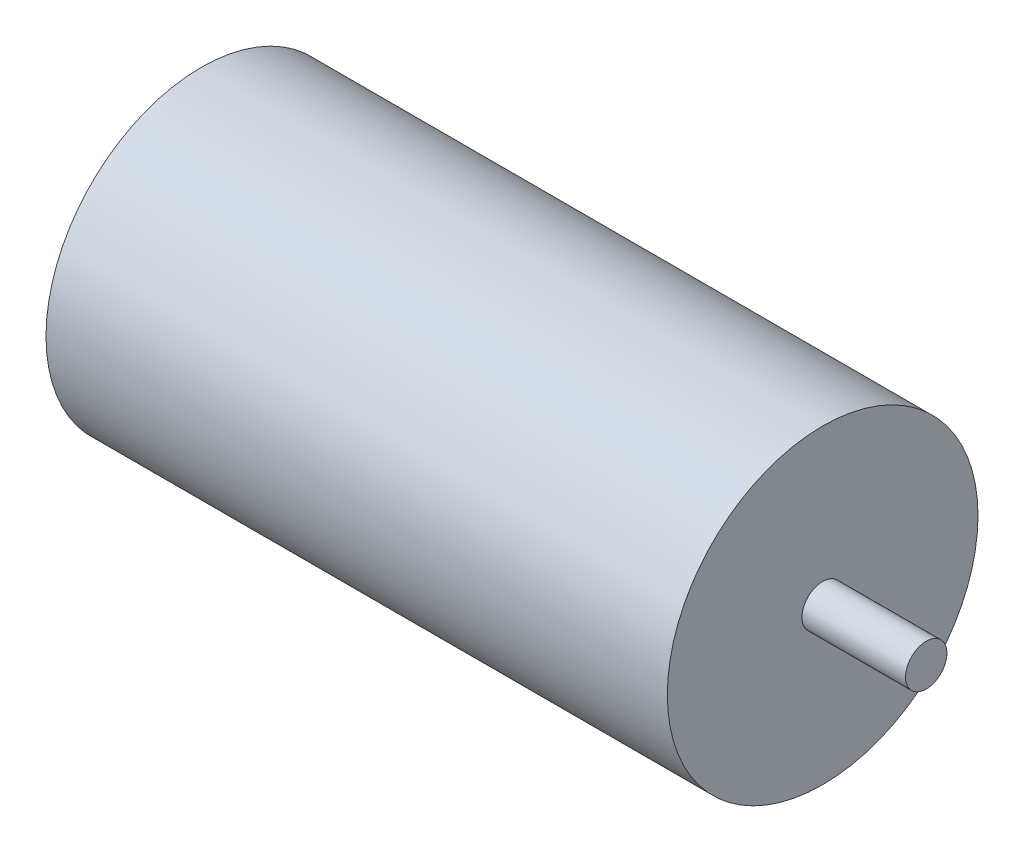
ISO-10303-21;
HEADER;
FILE_DESCRIPTION(('STEP AP214'),'2;1');
FILE_NAME('part.step','',(''),(''),'','','');
FILE_SCHEMA(('AUTOMOTIVE_DESIGN { 1 0 10303 214 1 1 1 1 }'));
ENDSEC;
DATA;
#1=APPLICATION_CONTEXT('core data for automotive mechanical design processes');
#2=APPLICATION_PROTOCOL_DEFINITION('international standard','automotive_design',2000,#1);
#3=PRODUCT_CONTEXT('',#1,'mechanical');
#4=PRODUCT('Part','Part','',(#3));
#5=PRODUCT_RELATED_PRODUCT_CATEGORY('part','',(#4));
#6=PRODUCT_DEFINITION_FORMATION('','',#4);
#7=PRODUCT_DEFINITION_CONTEXT('part definition',#1,'design');
#8=PRODUCT_DEFINITION('design','',#6,#7);
#9=PRODUCT_DEFINITION_SHAPE('','',#8);
#10=(LENGTH_UNIT() NAMED_UNIT(*) SI_UNIT(.MILLI.,.METRE.));
#11=(NAMED_UNIT(*) PLANE_ANGLE_UNIT() SI_UNIT($,.RADIAN.));
#12=(NAMED_UNIT(*) SI_UNIT($,.STERADIAN.) SOLID_ANGLE_UNIT());
#13=UNCERTAINTY_MEASURE_WITH_UNIT(LENGTH_MEASURE(1.E-05),#10,'distance_accuracy_value','');
#14=(GEOMETRIC_REPRESENTATION_CONTEXT(3) GLOBAL_UNCERTAINTY_ASSIGNED_CONTEXT((#13)) GLOBAL_UNIT_ASSIGNED_CONTEXT((#10,
#11,#12)) REPRESENTATION_CONTEXT('',''));
#15=CARTESIAN_POINT('',(0.,0.,0.));
#16=DIRECTION('',(0.,0.,1.));
#17=DIRECTION('',(1.,0.,0.));
#18=AXIS2_PLACEMENT_3D('',#15,#16,#17);
#19=CARTESIAN_POINT('',(120.,0.,0.));
#20=DIRECTION('',(-1.,0.,0.));
#21=DIRECTION('',(0.,0.,1.));
#22=AXIS2_PLACEMENT_3D('',#19,#20,#21);
#23=CYLINDRICAL_SURFACE('',#22,30.);
#24=CARTESIAN_POINT('',(120.,0.,0.));
#25=DIRECTION('',(1.,0.,0.));
#26=DIRECTION('',(0.,0.,-1.));
#27=AXIS2_PLACEMENT_3D('',#24,#25,#26);
#28=CIRCLE('',#27,30.);
#29=CARTESIAN_POINT('',(120.,0.,-30.));
#30=VERTEX_POINT('',#29);
#31=EDGE_CURVE('E51',#30,#30,#28,.T.);
#32=ORIENTED_EDGE('',*,*,#31,.F.);
#33=EDGE_LOOP('',(#32));
#34=FACE_BOUND('',#33,.T.);
#35=CARTESIAN_POINT('',(0.,0.,0.));
#36=DIRECTION('',(1.,0.,0.));
#37=DIRECTION('',(0.,0.,-1.));
#38=AXIS2_PLACEMENT_3D('',#35,#36,#37);
#39=CIRCLE('',#38,30.);
#40=CARTESIAN_POINT('',(0.,0.,-30.));
#41=VERTEX_POINT('',#40);
#42=EDGE_CURVE('E46',#41,#41,#39,.T.);
#43=ORIENTED_EDGE('',*,*,#42,.T.);
#44=EDGE_LOOP('',(#43));
#45=FACE_BOUND('',#44,.T.);
#46=ADVANCED_FACE('F43',(#34,#45),#23,.T.);
#47=CARTESIAN_POINT('',(120.,0.,0.));
#48=DIRECTION('',(1.,0.,0.));
#49=DIRECTION('',(0.,0.,-1.));
#50=AXIS2_PLACEMENT_3D('',#47,#48,#49);
#51=PLANE('',#50);
#52=CARTESIAN_POINT('',(120.,0.,0.));
#53=DIRECTION('',(1.,0.,0.));
#54=DIRECTION('',(0.,0.,-1.));
#55=AXIS2_PLACEMENT_3D('',#52,#53,#54);
#56=CIRCLE('',#55,4.);
#57=CARTESIAN_POINT('',(120.,0.,-4.));
#58=VERTEX_POINT('',#57);
#59=EDGE_CURVE('E10',#58,#58,#56,.T.);
#60=ORIENTED_EDGE('',*,*,#59,.F.);
#61=EDGE_LOOP('',(#60));
#62=FACE_BOUND('',#61,.T.);
#63=ORIENTED_EDGE('',*,*,#31,.T.);
#64=EDGE_LOOP('',(#63));
#65=FACE_BOUND('',#64,.T.);
#66=ADVANCED_FACE('F73',(#62,#65),#51,.T.);
#67=CARTESIAN_POINT('',(0.,0.,0.));
#68=DIRECTION('',(1.,0.,0.));
#69=DIRECTION('',(0.,0.,-1.));
#70=AXIS2_PLACEMENT_3D('',#67,#68,#69);
#71=PLANE('',#70);
#72=ORIENTED_EDGE('',*,*,#42,.F.);
#73=EDGE_LOOP('',(#72));
#74=FACE_BOUND('',#73,.T.);
#75=ADVANCED_FACE('F66',(#74),#71,.F.);
#76=CARTESIAN_POINT('',(140.,0.,0.));
#77=DIRECTION('',(-1.,0.,0.));
#78=DIRECTION('',(0.,0.,1.));
#79=AXIS2_PLACEMENT_3D('',#76,#77,#78);
#80=CYLINDRICAL_SURFACE('',#79,4.);
#81=CARTESIAN_POINT('',(140.,0.,0.));
#82=DIRECTION('',(1.,0.,0.));
#83=DIRECTION('',(0.,0.,-1.));
#84=AXIS2_PLACEMENT_3D('',#81,#82,#83);
#85=CIRCLE('',#84,4.);
#86=CARTESIAN_POINT('',(140.,0.,-4.));
#87=VERTEX_POINT('',#86);
#88=EDGE_CURVE('E59',#87,#87,#85,.T.);
#89=ORIENTED_EDGE('',*,*,#88,.F.);
#90=EDGE_LOOP('',(#89));
#91=FACE_BOUND('',#90,.T.);
#92=ORIENTED_EDGE('',*,*,#59,.T.);
#93=EDGE_LOOP('',(#92));
#94=FACE_BOUND('',#93,.T.);
#95=ADVANCED_FACE('F68',(#91,#94),#80,.T.);
#96=CARTESIAN_POINT('',(140.,0.,0.));
#97=DIRECTION('',(1.,0.,0.));
#98=DIRECTION('',(0.,0.,-1.));
#99=AXIS2_PLACEMENT_3D('',#96,#97,#98);
#100=PLANE('',#99);
#101=ORIENTED_EDGE('',*,*,#88,.T.);
#102=EDGE_LOOP('',(#101));
#103=FACE_BOUND('',#102,.T.);
#104=ADVANCED_FACE('F77',(#103),#100,.T.);
#105=CLOSED_SHELL('',(#46,#66,#75,#95,#104));
#106=MANIFOLD_SOLID_BREP('B2',#105);
#107=ADVANCED_BREP_SHAPE_REPRESENTATION('',(#18,#106),#14);
#108=SHAPE_DEFINITION_REPRESENTATION(#9,#107);
ENDSEC;
END-ISO-10303-21;
